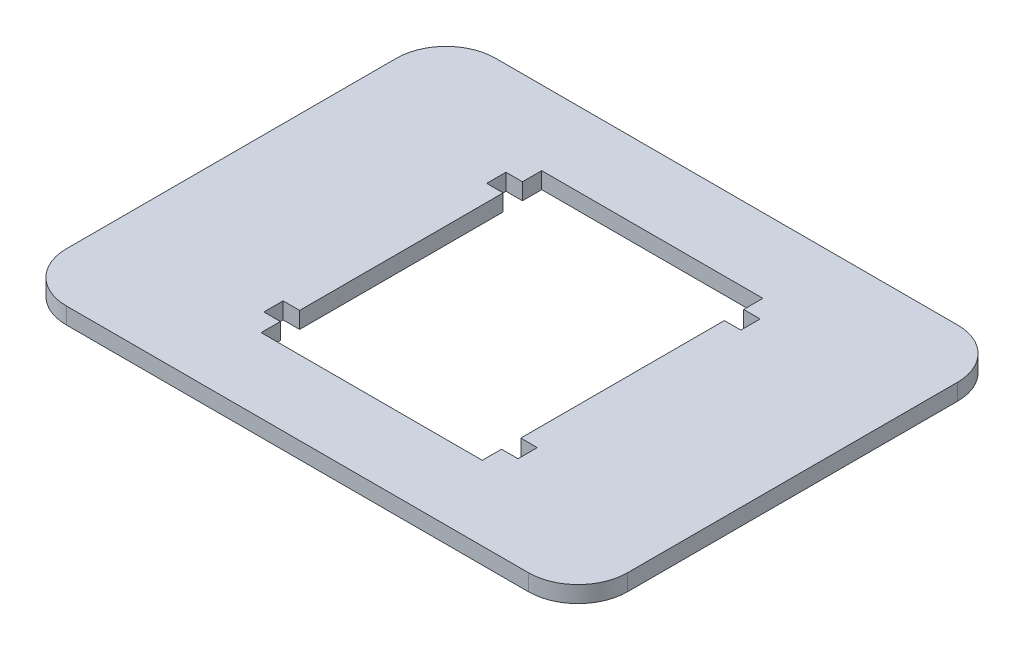
ISO-10303-21;
HEADER;
FILE_DESCRIPTION(('STEP AP214'),'2;1');
FILE_NAME('part.step','',(''),(''),'','','');
FILE_SCHEMA(('AUTOMOTIVE_DESIGN { 1 0 10303 214 1 1 1 1 }'));
ENDSEC;
DATA;
#1=APPLICATION_CONTEXT('core data for automotive mechanical design processes');
#2=APPLICATION_PROTOCOL_DEFINITION('international standard','automotive_design',2000,#1);
#3=PRODUCT_CONTEXT('',#1,'mechanical');
#4=PRODUCT('Part','Part','',(#3));
#5=PRODUCT_RELATED_PRODUCT_CATEGORY('part','',(#4));
#6=PRODUCT_DEFINITION_FORMATION('','',#4);
#7=PRODUCT_DEFINITION_CONTEXT('part definition',#1,'design');
#8=PRODUCT_DEFINITION('design','',#6,#7);
#9=PRODUCT_DEFINITION_SHAPE('','',#8);
#10=(LENGTH_UNIT() NAMED_UNIT(*) SI_UNIT(.MILLI.,.METRE.));
#11=(NAMED_UNIT(*) PLANE_ANGLE_UNIT() SI_UNIT($,.RADIAN.));
#12=(NAMED_UNIT(*) SI_UNIT($,.STERADIAN.) SOLID_ANGLE_UNIT());
#13=UNCERTAINTY_MEASURE_WITH_UNIT(LENGTH_MEASURE(1.E-05),#10,'distance_accuracy_value','');
#14=(GEOMETRIC_REPRESENTATION_CONTEXT(3) GLOBAL_UNCERTAINTY_ASSIGNED_CONTEXT((#13)) GLOBAL_UNIT_ASSIGNED_CONTEXT((#10,
#11,#12)) REPRESENTATION_CONTEXT('',''));
#15=CARTESIAN_POINT('',(0.,0.,0.));
#16=DIRECTION('',(0.,0.,1.));
#17=DIRECTION('',(1.,0.,0.));
#18=AXIS2_PLACEMENT_3D('',#15,#16,#17);
#19=CARTESIAN_POINT('',(0.,5.,0.));
#20=DIRECTION('',(0.,-1.,0.));
#21=DIRECTION('',(0.,0.,-1.));
#22=AXIS2_PLACEMENT_3D('',#19,#20,#21);
#23=PLANE('',#22);
#24=DIRECTION('',(0.,0.,-1.));
#25=VECTOR('',#24,1.);
#26=CARTESIAN_POINT('',(85.,5.,65.));
#27=LINE('',#26,#25);
#28=CARTESIAN_POINT('',(85.,5.,50.));
#29=VERTEX_POINT('',#28);
#30=CARTESIAN_POINT('',(85.,5.,-50.));
#31=VERTEX_POINT('',#30);
#32=EDGE_CURVE('E388',#29,#31,#27,.T.);
#33=ORIENTED_EDGE('',*,*,#32,.T.);
#34=CARTESIAN_POINT('',(70.,5.,-50.));
#35=DIRECTION('',(0.,-1.,0.));
#36=DIRECTION('',(0.,0.,-1.));
#37=AXIS2_PLACEMENT_3D('',#34,#35,#36);
#38=CIRCLE('',#37,15.);
#39=CARTESIAN_POINT('',(70.,5.,-65.));
#40=VERTEX_POINT('',#39);
#41=EDGE_CURVE('E431',#31,#40,#38,.F.);
#42=ORIENTED_EDGE('',*,*,#41,.T.);
#43=DIRECTION('',(-1.,0.,0.));
#44=VECTOR('',#43,1.);
#45=CARTESIAN_POINT('',(-85.,5.,-65.));
#46=LINE('',#45,#44);
#47=CARTESIAN_POINT('',(-70.,5.,-65.));
#48=VERTEX_POINT('',#47);
#49=EDGE_CURVE('E391',#40,#48,#46,.T.);
#50=ORIENTED_EDGE('',*,*,#49,.T.);
#51=CARTESIAN_POINT('',(-70.,5.,-50.));
#52=DIRECTION('',(0.,-1.,0.));
#53=DIRECTION('',(0.,0.,-1.));
#54=AXIS2_PLACEMENT_3D('',#51,#52,#53);
#55=CIRCLE('',#54,15.);
#56=CARTESIAN_POINT('',(-85.,5.,-50.));
#57=VERTEX_POINT('',#56);
#58=EDGE_CURVE('E426',#48,#57,#55,.F.);
#59=ORIENTED_EDGE('',*,*,#58,.T.);
#60=DIRECTION('',(0.,0.,1.));
#61=VECTOR('',#60,1.);
#62=CARTESIAN_POINT('',(-85.,5.,65.));
#63=LINE('',#62,#61);
#64=CARTESIAN_POINT('',(-85.,5.,50.));
#65=VERTEX_POINT('',#64);
#66=EDGE_CURVE('E395',#57,#65,#63,.T.);
#67=ORIENTED_EDGE('',*,*,#66,.T.);
#68=CARTESIAN_POINT('',(-70.,5.,50.));
#69=DIRECTION('',(0.,-1.,0.));
#70=DIRECTION('',(0.,0.,-1.));
#71=AXIS2_PLACEMENT_3D('',#68,#69,#70);
#72=CIRCLE('',#71,15.);
#73=CARTESIAN_POINT('',(-70.,5.,65.));
#74=VERTEX_POINT('',#73);
#75=EDGE_CURVE('E65',#65,#74,#72,.F.);
#76=ORIENTED_EDGE('',*,*,#75,.T.);
#77=DIRECTION('',(1.,0.,0.));
#78=VECTOR('',#77,1.);
#79=CARTESIAN_POINT('',(-85.,5.,65.));
#80=LINE('',#79,#78);
#81=CARTESIAN_POINT('',(70.,5.,65.));
#82=VERTEX_POINT('',#81);
#83=EDGE_CURVE('E397',#74,#82,#80,.T.);
#84=ORIENTED_EDGE('',*,*,#83,.T.);
#85=CARTESIAN_POINT('',(70.,5.,50.));
#86=DIRECTION('',(0.,-1.,0.));
#87=DIRECTION('',(0.,0.,-1.));
#88=AXIS2_PLACEMENT_3D('',#85,#86,#87);
#89=CIRCLE('',#88,15.);
#90=EDGE_CURVE('E429',#82,#29,#89,.F.);
#91=ORIENTED_EDGE('',*,*,#90,.T.);
#92=EDGE_LOOP('',(#33,#42,#50,#59,#67,#76,#84,#91));
#93=FACE_BOUND('',#92,.T.);
#94=DIRECTION('',(0.,0.,1.));
#95=VECTOR('',#94,1.);
#96=CARTESIAN_POINT('',(38.5000000000001,5.,1.83186809530969E-13));
#97=LINE('',#96,#95);
#98=CARTESIAN_POINT('',(38.5,5.,30.833334));
#99=VERTEX_POINT('',#98);
#100=CARTESIAN_POINT('',(38.5,5.,36.666667));
#101=VERTEX_POINT('',#100);
#102=EDGE_CURVE('E306',#99,#101,#97,.T.);
#103=ORIENTED_EDGE('',*,*,#102,.T.);
#104=DIRECTION('',(1.,0.,0.));
#105=VECTOR('',#104,1.);
#106=CARTESIAN_POINT('',(0.,5.,36.666667));
#107=LINE('',#106,#105);
#108=CARTESIAN_POINT('',(33.5,5.,36.666667));
#109=VERTEX_POINT('',#108);
#110=EDGE_CURVE('E301',#109,#101,#107,.T.);
#111=ORIENTED_EDGE('',*,*,#110,.F.);
#112=DIRECTION('',(0.,0.,-1.));
#113=VECTOR('',#112,1.);
#114=CARTESIAN_POINT('',(33.5,5.,42.5));
#115=LINE('',#114,#113);
#116=CARTESIAN_POINT('',(33.5,5.,42.5));
#117=VERTEX_POINT('',#116);
#118=EDGE_CURVE('E363',#117,#109,#115,.T.);
#119=ORIENTED_EDGE('',*,*,#118,.F.);
#120=DIRECTION('',(1.,0.,0.));
#121=VECTOR('',#120,1.);
#122=CARTESIAN_POINT('',(-33.5,5.,42.5));
#123=LINE('',#122,#121);
#124=CARTESIAN_POINT('',(-33.5,5.,42.5));
#125=VERTEX_POINT('',#124);
#126=EDGE_CURVE('E374',#125,#117,#123,.T.);
#127=ORIENTED_EDGE('',*,*,#126,.F.);
#128=DIRECTION('',(0.,0.,1.));
#129=VECTOR('',#128,1.);
#130=CARTESIAN_POINT('',(-33.5,5.,42.5));
#131=LINE('',#130,#129);
#132=CARTESIAN_POINT('',(-33.5,5.,36.666667));
#133=VERTEX_POINT('',#132);
#134=EDGE_CURVE('E370',#133,#125,#131,.T.);
#135=ORIENTED_EDGE('',*,*,#134,.F.);
#136=DIRECTION('',(-1.,0.,0.));
#137=VECTOR('',#136,1.);
#138=CARTESIAN_POINT('',(0.,5.,36.666667));
#139=LINE('',#138,#137);
#140=CARTESIAN_POINT('',(-38.5,5.,36.666667));
#141=VERTEX_POINT('',#140);
#142=EDGE_CURVE('E325',#133,#141,#139,.T.);
#143=ORIENTED_EDGE('',*,*,#142,.T.);
#144=DIRECTION('',(0.,0.,1.));
#145=VECTOR('',#144,1.);
#146=CARTESIAN_POINT('',(-38.5000000000001,5.,1.83186809530969E-13));
#147=LINE('',#146,#145);
#148=CARTESIAN_POINT('',(-38.5,5.,30.833334));
#149=VERTEX_POINT('',#148);
#150=EDGE_CURVE('E333',#149,#141,#147,.T.);
#151=ORIENTED_EDGE('',*,*,#150,.F.);
#152=DIRECTION('',(-1.,0.,0.));
#153=VECTOR('',#152,1.);
#154=CARTESIAN_POINT('',(0.,5.,30.833334));
#155=LINE('',#154,#153);
#156=CARTESIAN_POINT('',(-33.5,5.,30.833334));
#157=VERTEX_POINT('',#156);
#158=EDGE_CURVE('E270',#157,#149,#155,.T.);
#159=ORIENTED_EDGE('',*,*,#158,.F.);
#160=CARTESIAN_POINT('',(-33.5,5.,-30.833334));
#161=VERTEX_POINT('',#160);
#162=EDGE_CURVE('E375',#161,#157,#131,.T.);
#163=ORIENTED_EDGE('',*,*,#162,.F.);
#164=DIRECTION('',(-1.,0.,0.));
#165=VECTOR('',#164,1.);
#166=CARTESIAN_POINT('',(0.,5.,-30.833334));
#167=LINE('',#166,#165);
#168=CARTESIAN_POINT('',(-38.5,5.,-30.833334));
#169=VERTEX_POINT('',#168);
#170=EDGE_CURVE('E285',#161,#169,#167,.T.);
#171=ORIENTED_EDGE('',*,*,#170,.T.);
#172=DIRECTION('',(0.,0.,-1.));
#173=VECTOR('',#172,1.);
#174=CARTESIAN_POINT('',(-38.5000000000001,5.,-1.83186809530969E-13));
#175=LINE('',#174,#173);
#176=CARTESIAN_POINT('',(-38.5,5.,-36.666667));
#177=VERTEX_POINT('',#176);
#178=EDGE_CURVE('E282',#169,#177,#175,.T.);
#179=ORIENTED_EDGE('',*,*,#178,.T.);
#180=DIRECTION('',(-1.,0.,0.));
#181=VECTOR('',#180,1.);
#182=CARTESIAN_POINT('',(0.,5.,-36.666667));
#183=LINE('',#182,#181);
#184=CARTESIAN_POINT('',(-33.5,5.,-36.666667));
#185=VERTEX_POINT('',#184);
#186=EDGE_CURVE('E276',#185,#177,#183,.T.);
#187=ORIENTED_EDGE('',*,*,#186,.F.);
#188=CARTESIAN_POINT('',(-33.5,5.,-42.5));
#189=VERTEX_POINT('',#188);
#190=EDGE_CURVE('E371',#189,#185,#131,.T.);
#191=ORIENTED_EDGE('',*,*,#190,.F.);
#192=DIRECTION('',(-1.,0.,0.));
#193=VECTOR('',#192,1.);
#194=CARTESIAN_POINT('',(-33.5,5.,-42.5));
#195=LINE('',#194,#193);
#196=CARTESIAN_POINT('',(33.5,5.,-42.5));
#197=VERTEX_POINT('',#196);
#198=EDGE_CURVE('E366',#197,#189,#195,.T.);
#199=ORIENTED_EDGE('',*,*,#198,.F.);
#200=CARTESIAN_POINT('',(33.5,5.,-36.666667));
#201=VERTEX_POINT('',#200);
#202=EDGE_CURVE('E341',#201,#197,#115,.T.);
#203=ORIENTED_EDGE('',*,*,#202,.F.);
#204=DIRECTION('',(1.,0.,0.));
#205=VECTOR('',#204,1.);
#206=CARTESIAN_POINT('',(0.,5.,-36.666667));
#207=LINE('',#206,#205);
#208=CARTESIAN_POINT('',(38.5,5.,-36.666667));
#209=VERTEX_POINT('',#208);
#210=EDGE_CURVE('E257',#201,#209,#207,.T.);
#211=ORIENTED_EDGE('',*,*,#210,.T.);
#212=DIRECTION('',(0.,0.,-1.));
#213=VECTOR('',#212,1.);
#214=CARTESIAN_POINT('',(38.5000000000001,5.,-1.83186809530969E-13));
#215=LINE('',#214,#213);
#216=CARTESIAN_POINT('',(38.5,5.,-30.833334));
#217=VERTEX_POINT('',#216);
#218=EDGE_CURVE('E260',#217,#209,#215,.T.);
#219=ORIENTED_EDGE('',*,*,#218,.F.);
#220=DIRECTION('',(1.,0.,0.));
#221=VECTOR('',#220,1.);
#222=CARTESIAN_POINT('',(0.,5.,-30.833334));
#223=LINE('',#222,#221);
#224=CARTESIAN_POINT('',(33.5,5.,-30.833334));
#225=VERTEX_POINT('',#224);
#226=EDGE_CURVE('E235',#225,#217,#223,.T.);
#227=ORIENTED_EDGE('',*,*,#226,.F.);
#228=CARTESIAN_POINT('',(33.5,5.,30.833334));
#229=VERTEX_POINT('',#228);
#230=EDGE_CURVE('E367',#229,#225,#115,.T.);
#231=ORIENTED_EDGE('',*,*,#230,.F.);
#232=DIRECTION('',(1.,0.,0.));
#233=VECTOR('',#232,1.);
#234=CARTESIAN_POINT('',(0.,5.,30.833334));
#235=LINE('',#234,#233);
#236=EDGE_CURVE('E309',#229,#99,#235,.T.);
#237=ORIENTED_EDGE('',*,*,#236,.T.);
#238=EDGE_LOOP('',(#103,#111,#119,#127,#135,#143,#151,#159,#163,#171,#179,#187,#191,#199,#203,
#211,#219,#227,#231,#237));
#239=FACE_BOUND('',#238,.T.);
#240=ADVANCED_FACE('F43',(#93,#239),#23,.F.);
#241=CARTESIAN_POINT('',(0.,0.,0.));
#242=DIRECTION('',(0.,-1.,0.));
#243=DIRECTION('',(0.,0.,-1.));
#244=AXIS2_PLACEMENT_3D('',#241,#242,#243);
#245=PLANE('',#244);
#246=DIRECTION('',(1.,0.,0.));
#247=VECTOR('',#246,1.);
#248=CARTESIAN_POINT('',(0.,0.,36.666667));
#249=LINE('',#248,#247);
#250=CARTESIAN_POINT('',(33.5,0.,36.666667));
#251=VERTEX_POINT('',#250);
#252=CARTESIAN_POINT('',(38.5,0.,36.666667));
#253=VERTEX_POINT('',#252);
#254=EDGE_CURVE('E303',#251,#253,#249,.T.);
#255=ORIENTED_EDGE('',*,*,#254,.T.);
#256=DIRECTION('',(0.,0.,1.));
#257=VECTOR('',#256,1.);
#258=CARTESIAN_POINT('',(38.5000000000001,0.,1.83186809530969E-13));
#259=LINE('',#258,#257);
#260=CARTESIAN_POINT('',(38.5,0.,30.833334));
#261=VERTEX_POINT('',#260);
#262=EDGE_CURVE('E298',#261,#253,#259,.T.);
#263=ORIENTED_EDGE('',*,*,#262,.F.);
#264=DIRECTION('',(1.,0.,0.));
#265=VECTOR('',#264,1.);
#266=CARTESIAN_POINT('',(0.,0.,30.833334));
#267=LINE('',#266,#265);
#268=CARTESIAN_POINT('',(33.5,0.,30.833334));
#269=VERTEX_POINT('',#268);
#270=EDGE_CURVE('E300',#269,#261,#267,.T.);
#271=ORIENTED_EDGE('',*,*,#270,.F.);
#272=DIRECTION('',(0.,0.,-1.));
#273=VECTOR('',#272,1.);
#274=CARTESIAN_POINT('',(33.5,0.,42.5));
#275=LINE('',#274,#273);
#276=CARTESIAN_POINT('',(33.5,0.,-30.833334));
#277=VERTEX_POINT('',#276);
#278=EDGE_CURVE('E256',#269,#277,#275,.T.);
#279=ORIENTED_EDGE('',*,*,#278,.T.);
#280=DIRECTION('',(1.,0.,0.));
#281=VECTOR('',#280,1.);
#282=CARTESIAN_POINT('',(0.,0.,-30.833334));
#283=LINE('',#282,#281);
#284=CARTESIAN_POINT('',(38.5,0.,-30.833334));
#285=VERTEX_POINT('',#284);
#286=EDGE_CURVE('E232',#277,#285,#283,.T.);
#287=ORIENTED_EDGE('',*,*,#286,.T.);
#288=DIRECTION('',(0.,0.,-1.));
#289=VECTOR('',#288,1.);
#290=CARTESIAN_POINT('',(38.5000000000001,0.,-1.83186809530969E-13));
#291=LINE('',#290,#289);
#292=CARTESIAN_POINT('',(38.5,0.,-36.666667));
#293=VERTEX_POINT('',#292);
#294=EDGE_CURVE('E244',#285,#293,#291,.T.);
#295=ORIENTED_EDGE('',*,*,#294,.T.);
#296=DIRECTION('',(1.,0.,0.));
#297=VECTOR('',#296,1.);
#298=CARTESIAN_POINT('',(0.,0.,-36.666667));
#299=LINE('',#298,#297);
#300=CARTESIAN_POINT('',(33.5,0.,-36.666667));
#301=VERTEX_POINT('',#300);
#302=EDGE_CURVE('E248',#301,#293,#299,.T.);
#303=ORIENTED_EDGE('',*,*,#302,.F.);
#304=CARTESIAN_POINT('',(33.5,0.,-42.5));
#305=VERTEX_POINT('',#304);
#306=EDGE_CURVE('E351',#301,#305,#275,.T.);
#307=ORIENTED_EDGE('',*,*,#306,.T.);
#308=DIRECTION('',(-1.,0.,0.));
#309=VECTOR('',#308,1.);
#310=CARTESIAN_POINT('',(-33.5,0.,-42.5));
#311=LINE('',#310,#309);
#312=CARTESIAN_POINT('',(-33.5,0.,-42.5));
#313=VERTEX_POINT('',#312);
#314=EDGE_CURVE('E350',#305,#313,#311,.T.);
#315=ORIENTED_EDGE('',*,*,#314,.T.);
#316=DIRECTION('',(0.,0.,1.));
#317=VECTOR('',#316,1.);
#318=CARTESIAN_POINT('',(-33.5,0.,42.5));
#319=LINE('',#318,#317);
#320=CARTESIAN_POINT('',(-33.5,0.,-36.666667));
#321=VERTEX_POINT('',#320);
#322=EDGE_CURVE('E355',#313,#321,#319,.T.);
#323=ORIENTED_EDGE('',*,*,#322,.T.);
#324=DIRECTION('',(-1.,0.,0.));
#325=VECTOR('',#324,1.);
#326=CARTESIAN_POINT('',(0.,0.,-36.666667));
#327=LINE('',#326,#325);
#328=CARTESIAN_POINT('',(-38.5,0.,-36.666667));
#329=VERTEX_POINT('',#328);
#330=EDGE_CURVE('E278',#321,#329,#327,.T.);
#331=ORIENTED_EDGE('',*,*,#330,.T.);
#332=DIRECTION('',(0.,0.,-1.));
#333=VECTOR('',#332,1.);
#334=CARTESIAN_POINT('',(-38.5000000000001,0.,-1.83186809530969E-13));
#335=LINE('',#334,#333);
#336=CARTESIAN_POINT('',(-38.5,0.,-30.833334));
#337=VERTEX_POINT('',#336);
#338=EDGE_CURVE('E273',#337,#329,#335,.T.);
#339=ORIENTED_EDGE('',*,*,#338,.F.);
#340=DIRECTION('',(-1.,0.,0.));
#341=VECTOR('',#340,1.);
#342=CARTESIAN_POINT('',(0.,0.,-30.833334));
#343=LINE('',#342,#341);
#344=CARTESIAN_POINT('',(-33.5,0.,-30.833334));
#345=VERTEX_POINT('',#344);
#346=EDGE_CURVE('E275',#345,#337,#343,.T.);
#347=ORIENTED_EDGE('',*,*,#346,.F.);
#348=CARTESIAN_POINT('',(-33.5,0.,30.833334));
#349=VERTEX_POINT('',#348);
#350=EDGE_CURVE('E359',#345,#349,#319,.T.);
#351=ORIENTED_EDGE('',*,*,#350,.T.);
#352=DIRECTION('',(-1.,0.,0.));
#353=VECTOR('',#352,1.);
#354=CARTESIAN_POINT('',(0.,0.,30.833334));
#355=LINE('',#354,#353);
#356=CARTESIAN_POINT('',(-38.5,0.,30.833334));
#357=VERTEX_POINT('',#356);
#358=EDGE_CURVE('E321',#349,#357,#355,.T.);
#359=ORIENTED_EDGE('',*,*,#358,.T.);
#360=DIRECTION('',(0.,0.,1.));
#361=VECTOR('',#360,1.);
#362=CARTESIAN_POINT('',(-38.5000000000001,0.,1.83186809530969E-13));
#363=LINE('',#362,#361);
#364=CARTESIAN_POINT('',(-38.5,0.,36.666667));
#365=VERTEX_POINT('',#364);
#366=EDGE_CURVE('E324',#357,#365,#363,.T.);
#367=ORIENTED_EDGE('',*,*,#366,.T.);
#368=DIRECTION('',(-1.,0.,0.));
#369=VECTOR('',#368,1.);
#370=CARTESIAN_POINT('',(0.,0.,36.666667));
#371=LINE('',#370,#369);
#372=CARTESIAN_POINT('',(-33.5,0.,36.666667));
#373=VERTEX_POINT('',#372);
#374=EDGE_CURVE('E328',#373,#365,#371,.T.);
#375=ORIENTED_EDGE('',*,*,#374,.F.);
#376=CARTESIAN_POINT('',(-33.5,0.,42.5));
#377=VERTEX_POINT('',#376);
#378=EDGE_CURVE('E354',#373,#377,#319,.T.);
#379=ORIENTED_EDGE('',*,*,#378,.T.);
#380=DIRECTION('',(1.,0.,0.));
#381=VECTOR('',#380,1.);
#382=CARTESIAN_POINT('',(-33.5,0.,42.5));
#383=LINE('',#382,#381);
#384=CARTESIAN_POINT('',(33.5,0.,42.5));
#385=VERTEX_POINT('',#384);
#386=EDGE_CURVE('E358',#377,#385,#383,.T.);
#387=ORIENTED_EDGE('',*,*,#386,.T.);
#388=EDGE_CURVE('E347',#385,#251,#275,.T.);
#389=ORIENTED_EDGE('',*,*,#388,.T.);
#390=EDGE_LOOP('',(#255,#263,#271,#279,#287,#295,#303,#307,#315,#323,#331,#339,#347,#351,#359,
#367,#375,#379,#387,#389));
#391=FACE_BOUND('',#390,.T.);
#392=DIRECTION('',(-1.,0.,0.));
#393=VECTOR('',#392,1.);
#394=CARTESIAN_POINT('',(-85.,0.,-65.));
#395=LINE('',#394,#393);
#396=CARTESIAN_POINT('',(70.,0.,-65.));
#397=VERTEX_POINT('',#396);
#398=CARTESIAN_POINT('',(-70.,0.,-65.));
#399=VERTEX_POINT('',#398);
#400=EDGE_CURVE('E402',#397,#399,#395,.T.);
#401=ORIENTED_EDGE('',*,*,#400,.F.);
#402=CARTESIAN_POINT('',(70.,0.,-50.));
#403=DIRECTION('',(0.,-1.,0.));
#404=DIRECTION('',(0.,0.,-1.));
#405=AXIS2_PLACEMENT_3D('',#402,#403,#404);
#406=CIRCLE('',#405,15.);
#407=CARTESIAN_POINT('',(85.,0.,-50.));
#408=VERTEX_POINT('',#407);
#409=EDGE_CURVE('E419',#397,#408,#406,.T.);
#410=ORIENTED_EDGE('',*,*,#409,.T.);
#411=DIRECTION('',(0.,0.,-1.));
#412=VECTOR('',#411,1.);
#413=CARTESIAN_POINT('',(85.,0.,65.));
#414=LINE('',#413,#412);
#415=CARTESIAN_POINT('',(85.,0.,50.));
#416=VERTEX_POINT('',#415);
#417=EDGE_CURVE('E380',#416,#408,#414,.T.);
#418=ORIENTED_EDGE('',*,*,#417,.F.);
#419=CARTESIAN_POINT('',(70.,0.,50.));
#420=DIRECTION('',(0.,-1.,0.));
#421=DIRECTION('',(0.,0.,-1.));
#422=AXIS2_PLACEMENT_3D('',#419,#420,#421);
#423=CIRCLE('',#422,15.);
#424=CARTESIAN_POINT('',(70.,0.,65.));
#425=VERTEX_POINT('',#424);
#426=EDGE_CURVE('E417',#416,#425,#423,.T.);
#427=ORIENTED_EDGE('',*,*,#426,.T.);
#428=DIRECTION('',(1.,0.,0.));
#429=VECTOR('',#428,1.);
#430=CARTESIAN_POINT('',(-85.,0.,65.));
#431=LINE('',#430,#429);
#432=CARTESIAN_POINT('',(-70.,0.,65.));
#433=VERTEX_POINT('',#432);
#434=EDGE_CURVE('E392',#433,#425,#431,.T.);
#435=ORIENTED_EDGE('',*,*,#434,.F.);
#436=CARTESIAN_POINT('',(-70.,0.,50.));
#437=DIRECTION('',(0.,-1.,0.));
#438=DIRECTION('',(0.,0.,-1.));
#439=AXIS2_PLACEMENT_3D('',#436,#437,#438);
#440=CIRCLE('',#439,15.);
#441=CARTESIAN_POINT('',(-85.,0.,50.));
#442=VERTEX_POINT('',#441);
#443=EDGE_CURVE('E415',#433,#442,#440,.T.);
#444=ORIENTED_EDGE('',*,*,#443,.T.);
#445=DIRECTION('',(0.,0.,1.));
#446=VECTOR('',#445,1.);
#447=CARTESIAN_POINT('',(-85.,0.,65.));
#448=LINE('',#447,#446);
#449=CARTESIAN_POINT('',(-85.,0.,-50.));
#450=VERTEX_POINT('',#449);
#451=EDGE_CURVE('E405',#450,#442,#448,.T.);
#452=ORIENTED_EDGE('',*,*,#451,.F.);
#453=CARTESIAN_POINT('',(-70.,0.,-50.));
#454=DIRECTION('',(0.,-1.,0.));
#455=DIRECTION('',(0.,0.,-1.));
#456=AXIS2_PLACEMENT_3D('',#453,#454,#455);
#457=CIRCLE('',#456,15.);
#458=EDGE_CURVE('E413',#450,#399,#457,.T.);
#459=ORIENTED_EDGE('',*,*,#458,.T.);
#460=EDGE_LOOP('',(#401,#410,#418,#427,#435,#444,#452,#459));
#461=FACE_BOUND('',#460,.T.);
#462=ADVANCED_FACE('F252',(#391,#461),#245,.T.);
#463=CARTESIAN_POINT('',(33.5,0.,42.5));
#464=DIRECTION('',(1.,0.,0.));
#465=DIRECTION('',(0.,0.,-1.));
#466=AXIS2_PLACEMENT_3D('',#463,#464,#465);
#467=PLANE('',#466);
#468=DIRECTION('',(0.,1.,0.));
#469=VECTOR('',#468,1.);
#470=CARTESIAN_POINT('',(33.5,0.,30.833334));
#471=LINE('',#470,#469);
#472=EDGE_CURVE('E317',#269,#229,#471,.T.);
#473=ORIENTED_EDGE('',*,*,#472,.T.);
#474=ORIENTED_EDGE('',*,*,#230,.T.);
#475=DIRECTION('',(0.,1.,0.));
#476=VECTOR('',#475,1.);
#477=CARTESIAN_POINT('',(33.5,0.,-30.833334));
#478=LINE('',#477,#476);
#479=EDGE_CURVE('E240',#277,#225,#478,.T.);
#480=ORIENTED_EDGE('',*,*,#479,.F.);
#481=ORIENTED_EDGE('',*,*,#278,.F.);
#482=EDGE_LOOP('',(#473,#474,#480,#481));
#483=FACE_BOUND('',#482,.T.);
#484=ADVANCED_FACE('F479',(#483),#467,.F.);
#485=DIRECTION('',(0.,1.,0.));
#486=VECTOR('',#485,1.);
#487=CARTESIAN_POINT('',(33.5,0.,-36.666667));
#488=LINE('',#487,#486);
#489=EDGE_CURVE('E267',#301,#201,#488,.T.);
#490=ORIENTED_EDGE('',*,*,#489,.T.);
#491=ORIENTED_EDGE('',*,*,#202,.T.);
#492=DIRECTION('',(0.,1.,0.));
#493=VECTOR('',#492,1.);
#494=CARTESIAN_POINT('',(33.5,0.,-42.5));
#495=LINE('',#494,#493);
#496=EDGE_CURVE('E362',#305,#197,#495,.T.);
#497=ORIENTED_EDGE('',*,*,#496,.F.);
#498=ORIENTED_EDGE('',*,*,#306,.F.);
#499=EDGE_LOOP('',(#490,#491,#497,#498));
#500=FACE_BOUND('',#499,.T.);
#501=ADVANCED_FACE('F658',(#500),#467,.F.);
#502=CARTESIAN_POINT('',(-33.5,0.,42.5));
#503=DIRECTION('',(-1.,0.,0.));
#504=DIRECTION('',(0.,0.,1.));
#505=AXIS2_PLACEMENT_3D('',#502,#503,#504);
#506=PLANE('',#505);
#507=DIRECTION('',(0.,1.,0.));
#508=VECTOR('',#507,1.);
#509=CARTESIAN_POINT('',(-33.5,0.,-30.833334));
#510=LINE('',#509,#508);
#511=EDGE_CURVE('E294',#345,#161,#510,.T.);
#512=ORIENTED_EDGE('',*,*,#511,.T.);
#513=ORIENTED_EDGE('',*,*,#162,.T.);
#514=DIRECTION('',(0.,1.,0.));
#515=VECTOR('',#514,1.);
#516=CARTESIAN_POINT('',(-33.5,0.,30.833334));
#517=LINE('',#516,#515);
#518=EDGE_CURVE('E330',#349,#157,#517,.T.);
#519=ORIENTED_EDGE('',*,*,#518,.F.);
#520=ORIENTED_EDGE('',*,*,#350,.F.);
#521=EDGE_LOOP('',(#512,#513,#519,#520));
#522=FACE_BOUND('',#521,.T.);
#523=ADVANCED_FACE('F669',(#522),#506,.F.);
#524=DIRECTION('',(0.,1.,0.));
#525=VECTOR('',#524,1.);
#526=CARTESIAN_POINT('',(-33.5,0.,36.666667));
#527=LINE('',#526,#525);
#528=EDGE_CURVE('E338',#373,#133,#527,.T.);
#529=ORIENTED_EDGE('',*,*,#528,.T.);
#530=ORIENTED_EDGE('',*,*,#134,.T.);
#531=DIRECTION('',(0.,1.,0.));
#532=VECTOR('',#531,1.);
#533=CARTESIAN_POINT('',(-33.5,0.,42.5));
#534=LINE('',#533,#532);
#535=EDGE_CURVE('E381',#377,#125,#534,.T.);
#536=ORIENTED_EDGE('',*,*,#535,.F.);
#537=ORIENTED_EDGE('',*,*,#378,.F.);
#538=EDGE_LOOP('',(#529,#530,#536,#537));
#539=FACE_BOUND('',#538,.T.);
#540=ADVANCED_FACE('F493',(#539),#506,.F.);
#541=CARTESIAN_POINT('',(85.,5.,65.));
#542=DIRECTION('',(-1.,0.,0.));
#543=DIRECTION('',(0.,0.,1.));
#544=AXIS2_PLACEMENT_3D('',#541,#542,#543);
#545=PLANE('',#544);
#546=ORIENTED_EDGE('',*,*,#417,.T.);
#547=DIRECTION('',(0.,-1.,0.));
#548=VECTOR('',#547,1.);
#549=CARTESIAN_POINT('',(85.,5.,-50.));
#550=LINE('',#549,#548);
#551=EDGE_CURVE('E424',#408,#31,#550,.F.);
#552=ORIENTED_EDGE('',*,*,#551,.T.);
#553=ORIENTED_EDGE('',*,*,#32,.F.);
#554=DIRECTION('',(0.,-1.,0.));
#555=VECTOR('',#554,1.);
#556=CARTESIAN_POINT('',(85.,5.,50.));
#557=LINE('',#556,#555);
#558=EDGE_CURVE('E421',#29,#416,#557,.T.);
#559=ORIENTED_EDGE('',*,*,#558,.T.);
#560=EDGE_LOOP('',(#546,#552,#553,#559));
#561=FACE_BOUND('',#560,.T.);
#562=ADVANCED_FACE('F459',(#561),#545,.F.);
#563=CARTESIAN_POINT('',(-85.,5.,-65.));
#564=DIRECTION('',(0.,0.,1.));
#565=DIRECTION('',(1.,0.,0.));
#566=AXIS2_PLACEMENT_3D('',#563,#564,#565);
#567=PLANE('',#566);
#568=ORIENTED_EDGE('',*,*,#49,.F.);
#569=DIRECTION('',(0.,-1.,0.));
#570=VECTOR('',#569,1.);
#571=CARTESIAN_POINT('',(70.,5.,-65.));
#572=LINE('',#571,#570);
#573=EDGE_CURVE('E410',#40,#397,#572,.T.);
#574=ORIENTED_EDGE('',*,*,#573,.T.);
#575=ORIENTED_EDGE('',*,*,#400,.T.);
#576=DIRECTION('',(0.,-1.,0.));
#577=VECTOR('',#576,1.);
#578=CARTESIAN_POINT('',(-70.,5.,-65.));
#579=LINE('',#578,#577);
#580=EDGE_CURVE('E399',#399,#48,#579,.F.);
#581=ORIENTED_EDGE('',*,*,#580,.T.);
#582=EDGE_LOOP('',(#568,#574,#575,#581));
#583=FACE_BOUND('',#582,.T.);
#584=ADVANCED_FACE('F467',(#583),#567,.F.);
#585=CARTESIAN_POINT('',(-85.,5.,65.));
#586=DIRECTION('',(1.,0.,0.));
#587=DIRECTION('',(0.,0.,-1.));
#588=AXIS2_PLACEMENT_3D('',#585,#586,#587);
#589=PLANE('',#588);
#590=ORIENTED_EDGE('',*,*,#451,.T.);
#591=DIRECTION('',(0.,-1.,0.));
#592=VECTOR('',#591,1.);
#593=CARTESIAN_POINT('',(-85.,5.,50.));
#594=LINE('',#593,#592);
#595=EDGE_CURVE('E11',#442,#65,#594,.F.);
#596=ORIENTED_EDGE('',*,*,#595,.T.);
#597=ORIENTED_EDGE('',*,*,#66,.F.);
#598=DIRECTION('',(0.,-1.,0.));
#599=VECTOR('',#598,1.);
#600=CARTESIAN_POINT('',(-85.,5.,-50.));
#601=LINE('',#600,#599);
#602=EDGE_CURVE('E51',#57,#450,#601,.T.);
#603=ORIENTED_EDGE('',*,*,#602,.T.);
#604=EDGE_LOOP('',(#590,#596,#597,#603));
#605=FACE_BOUND('',#604,.T.);
#606=ADVANCED_FACE('F441',(#605),#589,.F.);
#607=CARTESIAN_POINT('',(-85.,5.,65.));
#608=DIRECTION('',(0.,0.,-1.));
#609=DIRECTION('',(-1.,0.,0.));
#610=AXIS2_PLACEMENT_3D('',#607,#608,#609);
#611=PLANE('',#610);
#612=ORIENTED_EDGE('',*,*,#434,.T.);
#613=DIRECTION('',(0.,-1.,0.));
#614=VECTOR('',#613,1.);
#615=CARTESIAN_POINT('',(70.,5.,65.));
#616=LINE('',#615,#614);
#617=EDGE_CURVE('E58',#425,#82,#616,.F.);
#618=ORIENTED_EDGE('',*,*,#617,.T.);
#619=ORIENTED_EDGE('',*,*,#83,.F.);
#620=DIRECTION('',(0.,-1.,0.));
#621=VECTOR('',#620,1.);
#622=CARTESIAN_POINT('',(-70.,5.,65.));
#623=LINE('',#622,#621);
#624=EDGE_CURVE('E433',#74,#433,#623,.T.);
#625=ORIENTED_EDGE('',*,*,#624,.T.);
#626=EDGE_LOOP('',(#612,#618,#619,#625));
#627=FACE_BOUND('',#626,.T.);
#628=ADVANCED_FACE('F450',(#627),#611,.F.);
#629=ORIENTED_EDGE('',*,*,#118,.T.);
#630=DIRECTION('',(0.,1.,0.));
#631=VECTOR('',#630,1.);
#632=CARTESIAN_POINT('',(33.5,0.,36.666667));
#633=LINE('',#632,#631);
#634=EDGE_CURVE('E315',#251,#109,#633,.T.);
#635=ORIENTED_EDGE('',*,*,#634,.F.);
#636=ORIENTED_EDGE('',*,*,#388,.F.);
#637=DIRECTION('',(0.,1.,0.));
#638=VECTOR('',#637,1.);
#639=CARTESIAN_POINT('',(33.5,0.,42.5));
#640=LINE('',#639,#638);
#641=EDGE_CURVE('E378',#385,#117,#640,.T.);
#642=ORIENTED_EDGE('',*,*,#641,.T.);
#643=EDGE_LOOP('',(#629,#635,#636,#642));
#644=FACE_BOUND('',#643,.T.);
#645=ADVANCED_FACE('F482',(#644),#467,.F.);
#646=CARTESIAN_POINT('',(-33.5,0.,42.5));
#647=DIRECTION('',(0.,0.,1.));
#648=DIRECTION('',(1.,0.,0.));
#649=AXIS2_PLACEMENT_3D('',#646,#647,#648);
#650=PLANE('',#649);
#651=ORIENTED_EDGE('',*,*,#126,.T.);
#652=ORIENTED_EDGE('',*,*,#641,.F.);
#653=ORIENTED_EDGE('',*,*,#386,.F.);
#654=ORIENTED_EDGE('',*,*,#535,.T.);
#655=EDGE_LOOP('',(#651,#652,#653,#654));
#656=FACE_BOUND('',#655,.T.);
#657=ADVANCED_FACE('F704',(#656),#650,.F.);
#658=ORIENTED_EDGE('',*,*,#190,.T.);
#659=DIRECTION('',(0.,1.,0.));
#660=VECTOR('',#659,1.);
#661=CARTESIAN_POINT('',(-33.5,0.,-36.666667));
#662=LINE('',#661,#660);
#663=EDGE_CURVE('E292',#321,#185,#662,.T.);
#664=ORIENTED_EDGE('',*,*,#663,.F.);
#665=ORIENTED_EDGE('',*,*,#322,.F.);
#666=DIRECTION('',(0.,1.,0.));
#667=VECTOR('',#666,1.);
#668=CARTESIAN_POINT('',(-33.5,0.,-42.5));
#669=LINE('',#668,#667);
#670=EDGE_CURVE('E384',#313,#189,#669,.T.);
#671=ORIENTED_EDGE('',*,*,#670,.T.);
#672=EDGE_LOOP('',(#658,#664,#665,#671));
#673=FACE_BOUND('',#672,.T.);
#674=ADVANCED_FACE('F680',(#673),#506,.F.);
#675=CARTESIAN_POINT('',(-33.5,0.,-42.5));
#676=DIRECTION('',(0.,0.,-1.));
#677=DIRECTION('',(-1.,0.,0.));
#678=AXIS2_PLACEMENT_3D('',#675,#676,#677);
#679=PLANE('',#678);
#680=ORIENTED_EDGE('',*,*,#198,.T.);
#681=ORIENTED_EDGE('',*,*,#670,.F.);
#682=ORIENTED_EDGE('',*,*,#314,.F.);
#683=ORIENTED_EDGE('',*,*,#496,.T.);
#684=EDGE_LOOP('',(#680,#681,#682,#683));
#685=FACE_BOUND('',#684,.T.);
#686=ADVANCED_FACE('F637',(#685),#679,.F.);
#687=CARTESIAN_POINT('',(0.,0.,36.666667));
#688=DIRECTION('',(0.,0.,-1.));
#689=DIRECTION('',(-1.,0.,0.));
#690=AXIS2_PLACEMENT_3D('',#687,#688,#689);
#691=PLANE('',#690);
#692=ORIENTED_EDGE('',*,*,#142,.F.);
#693=ORIENTED_EDGE('',*,*,#528,.F.);
#694=ORIENTED_EDGE('',*,*,#374,.T.);
#695=DIRECTION('',(0.,1.,0.));
#696=VECTOR('',#695,1.);
#697=CARTESIAN_POINT('',(-38.5,0.,36.666667));
#698=LINE('',#697,#696);
#699=EDGE_CURVE('E342',#365,#141,#698,.T.);
#700=ORIENTED_EDGE('',*,*,#699,.T.);
#701=EDGE_LOOP('',(#692,#693,#694,#700));
#702=FACE_BOUND('',#701,.T.);
#703=ADVANCED_FACE('F627',(#702),#691,.T.);
#704=CARTESIAN_POINT('',(-38.5000000000001,0.,1.83186809530969E-13));
#705=DIRECTION('',(-1.,0.,0.));
#706=DIRECTION('',(0.,0.,1.));
#707=AXIS2_PLACEMENT_3D('',#704,#705,#706);
#708=PLANE('',#707);
#709=ORIENTED_EDGE('',*,*,#150,.T.);
#710=ORIENTED_EDGE('',*,*,#699,.F.);
#711=ORIENTED_EDGE('',*,*,#366,.F.);
#712=DIRECTION('',(0.,1.,0.));
#713=VECTOR('',#712,1.);
#714=CARTESIAN_POINT('',(-38.5,0.,30.833334));
#715=LINE('',#714,#713);
#716=EDGE_CURVE('E344',#357,#149,#715,.T.);
#717=ORIENTED_EDGE('',*,*,#716,.T.);
#718=EDGE_LOOP('',(#709,#710,#711,#717));
#719=FACE_BOUND('',#718,.T.);
#720=ADVANCED_FACE('F617',(#719),#708,.F.);
#721=CARTESIAN_POINT('',(0.,0.,30.833334));
#722=DIRECTION('',(0.,0.,-1.));
#723=DIRECTION('',(-1.,0.,0.));
#724=AXIS2_PLACEMENT_3D('',#721,#722,#723);
#725=PLANE('',#724);
#726=ORIENTED_EDGE('',*,*,#158,.T.);
#727=ORIENTED_EDGE('',*,*,#716,.F.);
#728=ORIENTED_EDGE('',*,*,#358,.F.);
#729=ORIENTED_EDGE('',*,*,#518,.T.);
#730=EDGE_LOOP('',(#726,#727,#728,#729));
#731=FACE_BOUND('',#730,.T.);
#732=ADVANCED_FACE('F607',(#731),#725,.F.);
#733=CARTESIAN_POINT('',(-38.5000000000001,0.,-1.83186809530969E-13));
#734=DIRECTION('',(1.,0.,0.));
#735=DIRECTION('',(0.,0.,-1.));
#736=AXIS2_PLACEMENT_3D('',#733,#734,#735);
#737=PLANE('',#736);
#738=ORIENTED_EDGE('',*,*,#178,.F.);
#739=DIRECTION('',(0.,1.,0.));
#740=VECTOR('',#739,1.);
#741=CARTESIAN_POINT('',(-38.5,0.,-30.833334));
#742=LINE('',#741,#740);
#743=EDGE_CURVE('E281',#337,#169,#742,.T.);
#744=ORIENTED_EDGE('',*,*,#743,.F.);
#745=ORIENTED_EDGE('',*,*,#338,.T.);
#746=DIRECTION('',(0.,1.,0.));
#747=VECTOR('',#746,1.);
#748=CARTESIAN_POINT('',(-38.5,0.,-36.666667));
#749=LINE('',#748,#747);
#750=EDGE_CURVE('E265',#329,#177,#749,.T.);
#751=ORIENTED_EDGE('',*,*,#750,.T.);
#752=EDGE_LOOP('',(#738,#744,#745,#751));
#753=FACE_BOUND('',#752,.T.);
#754=ADVANCED_FACE('F597',(#753),#737,.T.);
#755=CARTESIAN_POINT('',(0.,0.,-36.666667));
#756=DIRECTION('',(0.,0.,-1.));
#757=DIRECTION('',(-1.,0.,0.));
#758=AXIS2_PLACEMENT_3D('',#755,#756,#757);
#759=PLANE('',#758);
#760=ORIENTED_EDGE('',*,*,#186,.T.);
#761=ORIENTED_EDGE('',*,*,#750,.F.);
#762=ORIENTED_EDGE('',*,*,#330,.F.);
#763=ORIENTED_EDGE('',*,*,#663,.T.);
#764=EDGE_LOOP('',(#760,#761,#762,#763));
#765=FACE_BOUND('',#764,.T.);
#766=ADVANCED_FACE('F587',(#765),#759,.F.);
#767=CARTESIAN_POINT('',(0.,0.,-30.833334));
#768=DIRECTION('',(0.,0.,-1.));
#769=DIRECTION('',(-1.,0.,0.));
#770=AXIS2_PLACEMENT_3D('',#767,#768,#769);
#771=PLANE('',#770);
#772=ORIENTED_EDGE('',*,*,#170,.F.);
#773=ORIENTED_EDGE('',*,*,#511,.F.);
#774=ORIENTED_EDGE('',*,*,#346,.T.);
#775=ORIENTED_EDGE('',*,*,#743,.T.);
#776=EDGE_LOOP('',(#772,#773,#774,#775));
#777=FACE_BOUND('',#776,.T.);
#778=ADVANCED_FACE('F577',(#777),#771,.T.);
#779=CARTESIAN_POINT('',(0.,0.,-36.666667));
#780=DIRECTION('',(0.,0.,1.));
#781=DIRECTION('',(1.,0.,0.));
#782=AXIS2_PLACEMENT_3D('',#779,#780,#781);
#783=PLANE('',#782);
#784=ORIENTED_EDGE('',*,*,#210,.F.);
#785=ORIENTED_EDGE('',*,*,#489,.F.);
#786=ORIENTED_EDGE('',*,*,#302,.T.);
#787=DIRECTION('',(0.,1.,0.));
#788=VECTOR('',#787,1.);
#789=CARTESIAN_POINT('',(38.5,0.,-36.666667));
#790=LINE('',#789,#788);
#791=EDGE_CURVE('E239',#293,#209,#790,.T.);
#792=ORIENTED_EDGE('',*,*,#791,.T.);
#793=EDGE_LOOP('',(#784,#785,#786,#792));
#794=FACE_BOUND('',#793,.T.);
#795=ADVANCED_FACE('F568',(#794),#783,.T.);
#796=CARTESIAN_POINT('',(38.5000000000001,0.,-1.83186809530969E-13));
#797=DIRECTION('',(1.,0.,0.));
#798=DIRECTION('',(0.,0.,-1.));
#799=AXIS2_PLACEMENT_3D('',#796,#797,#798);
#800=PLANE('',#799);
#801=ORIENTED_EDGE('',*,*,#218,.T.);
#802=ORIENTED_EDGE('',*,*,#791,.F.);
#803=ORIENTED_EDGE('',*,*,#294,.F.);
#804=DIRECTION('',(0.,1.,0.));
#805=VECTOR('',#804,1.);
#806=CARTESIAN_POINT('',(38.5,0.,-30.833334));
#807=LINE('',#806,#805);
#808=EDGE_CURVE('E228',#285,#217,#807,.T.);
#809=ORIENTED_EDGE('',*,*,#808,.T.);
#810=EDGE_LOOP('',(#801,#802,#803,#809));
#811=FACE_BOUND('',#810,.T.);
#812=ADVANCED_FACE('F245',(#811),#800,.F.);
#813=CARTESIAN_POINT('',(0.,0.,-30.833334));
#814=DIRECTION('',(0.,0.,1.));
#815=DIRECTION('',(1.,0.,0.));
#816=AXIS2_PLACEMENT_3D('',#813,#814,#815);
#817=PLANE('',#816);
#818=ORIENTED_EDGE('',*,*,#226,.T.);
#819=ORIENTED_EDGE('',*,*,#808,.F.);
#820=ORIENTED_EDGE('',*,*,#286,.F.);
#821=ORIENTED_EDGE('',*,*,#479,.T.);
#822=EDGE_LOOP('',(#818,#819,#820,#821));
#823=FACE_BOUND('',#822,.T.);
#824=ADVANCED_FACE('F230',(#823),#817,.F.);
#825=CARTESIAN_POINT('',(38.5000000000001,0.,1.83186809530969E-13));
#826=DIRECTION('',(-1.,0.,0.));
#827=DIRECTION('',(0.,0.,1.));
#828=AXIS2_PLACEMENT_3D('',#825,#826,#827);
#829=PLANE('',#828);
#830=ORIENTED_EDGE('',*,*,#102,.F.);
#831=DIRECTION('',(0.,1.,0.));
#832=VECTOR('',#831,1.);
#833=CARTESIAN_POINT('',(38.5,0.,30.833334));
#834=LINE('',#833,#832);
#835=EDGE_CURVE('E305',#261,#99,#834,.T.);
#836=ORIENTED_EDGE('',*,*,#835,.F.);
#837=ORIENTED_EDGE('',*,*,#262,.T.);
#838=DIRECTION('',(0.,1.,0.));
#839=VECTOR('',#838,1.);
#840=CARTESIAN_POINT('',(38.5,0.,36.666667));
#841=LINE('',#840,#839);
#842=EDGE_CURVE('E286',#253,#101,#841,.T.);
#843=ORIENTED_EDGE('',*,*,#842,.T.);
#844=EDGE_LOOP('',(#830,#836,#837,#843));
#845=FACE_BOUND('',#844,.T.);
#846=ADVANCED_FACE('F541',(#845),#829,.T.);
#847=CARTESIAN_POINT('',(0.,0.,36.666667));
#848=DIRECTION('',(0.,0.,1.));
#849=DIRECTION('',(1.,0.,0.));
#850=AXIS2_PLACEMENT_3D('',#847,#848,#849);
#851=PLANE('',#850);
#852=ORIENTED_EDGE('',*,*,#110,.T.);
#853=ORIENTED_EDGE('',*,*,#842,.F.);
#854=ORIENTED_EDGE('',*,*,#254,.F.);
#855=ORIENTED_EDGE('',*,*,#634,.T.);
#856=EDGE_LOOP('',(#852,#853,#854,#855));
#857=FACE_BOUND('',#856,.T.);
#858=ADVANCED_FACE('F532',(#857),#851,.F.);
#859=CARTESIAN_POINT('',(0.,0.,30.833334));
#860=DIRECTION('',(0.,0.,1.));
#861=DIRECTION('',(1.,0.,0.));
#862=AXIS2_PLACEMENT_3D('',#859,#860,#861);
#863=PLANE('',#862);
#864=ORIENTED_EDGE('',*,*,#236,.F.);
#865=ORIENTED_EDGE('',*,*,#472,.F.);
#866=ORIENTED_EDGE('',*,*,#270,.T.);
#867=ORIENTED_EDGE('',*,*,#835,.T.);
#868=EDGE_LOOP('',(#864,#865,#866,#867));
#869=FACE_BOUND('',#868,.T.);
#870=ADVANCED_FACE('F496',(#869),#863,.T.);
#871=CARTESIAN_POINT('',(70.,5.,-50.));
#872=DIRECTION('',(0.,-1.,0.));
#873=DIRECTION('',(0.,0.,-1.));
#874=AXIS2_PLACEMENT_3D('',#871,#872,#873);
#875=CYLINDRICAL_SURFACE('',#874,15.);
#876=ORIENTED_EDGE('',*,*,#41,.F.);
#877=ORIENTED_EDGE('',*,*,#551,.F.);
#878=ORIENTED_EDGE('',*,*,#409,.F.);
#879=ORIENTED_EDGE('',*,*,#573,.F.);
#880=EDGE_LOOP('',(#876,#877,#878,#879));
#881=FACE_BOUND('',#880,.T.);
#882=ADVANCED_FACE('F464',(#881),#875,.T.);
#883=CARTESIAN_POINT('',(70.,5.,50.));
#884=DIRECTION('',(0.,-1.,0.));
#885=DIRECTION('',(0.,0.,-1.));
#886=AXIS2_PLACEMENT_3D('',#883,#884,#885);
#887=CYLINDRICAL_SURFACE('',#886,15.);
#888=ORIENTED_EDGE('',*,*,#90,.F.);
#889=ORIENTED_EDGE('',*,*,#617,.F.);
#890=ORIENTED_EDGE('',*,*,#426,.F.);
#891=ORIENTED_EDGE('',*,*,#558,.F.);
#892=EDGE_LOOP('',(#888,#889,#890,#891));
#893=FACE_BOUND('',#892,.T.);
#894=ADVANCED_FACE('F456',(#893),#887,.T.);
#895=CARTESIAN_POINT('',(-70.,5.,50.));
#896=DIRECTION('',(0.,-1.,0.));
#897=DIRECTION('',(0.,0.,-1.));
#898=AXIS2_PLACEMENT_3D('',#895,#896,#897);
#899=CYLINDRICAL_SURFACE('',#898,15.);
#900=ORIENTED_EDGE('',*,*,#75,.F.);
#901=ORIENTED_EDGE('',*,*,#595,.F.);
#902=ORIENTED_EDGE('',*,*,#443,.F.);
#903=ORIENTED_EDGE('',*,*,#624,.F.);
#904=EDGE_LOOP('',(#900,#901,#902,#903));
#905=FACE_BOUND('',#904,.T.);
#906=ADVANCED_FACE('F449',(#905),#899,.T.);
#907=CARTESIAN_POINT('',(-70.,5.,-50.));
#908=DIRECTION('',(0.,-1.,0.));
#909=DIRECTION('',(0.,0.,-1.));
#910=AXIS2_PLACEMENT_3D('',#907,#908,#909);
#911=CYLINDRICAL_SURFACE('',#910,15.);
#912=ORIENTED_EDGE('',*,*,#58,.F.);
#913=ORIENTED_EDGE('',*,*,#580,.F.);
#914=ORIENTED_EDGE('',*,*,#458,.F.);
#915=ORIENTED_EDGE('',*,*,#602,.F.);
#916=EDGE_LOOP('',(#912,#913,#914,#915));
#917=FACE_BOUND('',#916,.T.);
#918=ADVANCED_FACE('F45',(#917),#911,.T.);
#919=CLOSED_SHELL('',(#240,#462,#484,#501,#523,#540,#562,#584,#606,#628,#645,#657,#674,#686,
#703,#720,#732,#754,#766,#778,#795,#812,#824,#846,#858,#870,#882,#894,#906,#918));
#920=MANIFOLD_SOLID_BREP('B2',#919);
#921=ADVANCED_BREP_SHAPE_REPRESENTATION('',(#18,#920),#14);
#922=SHAPE_DEFINITION_REPRESENTATION(#9,#921);
ENDSEC;
END-ISO-10303-21;
